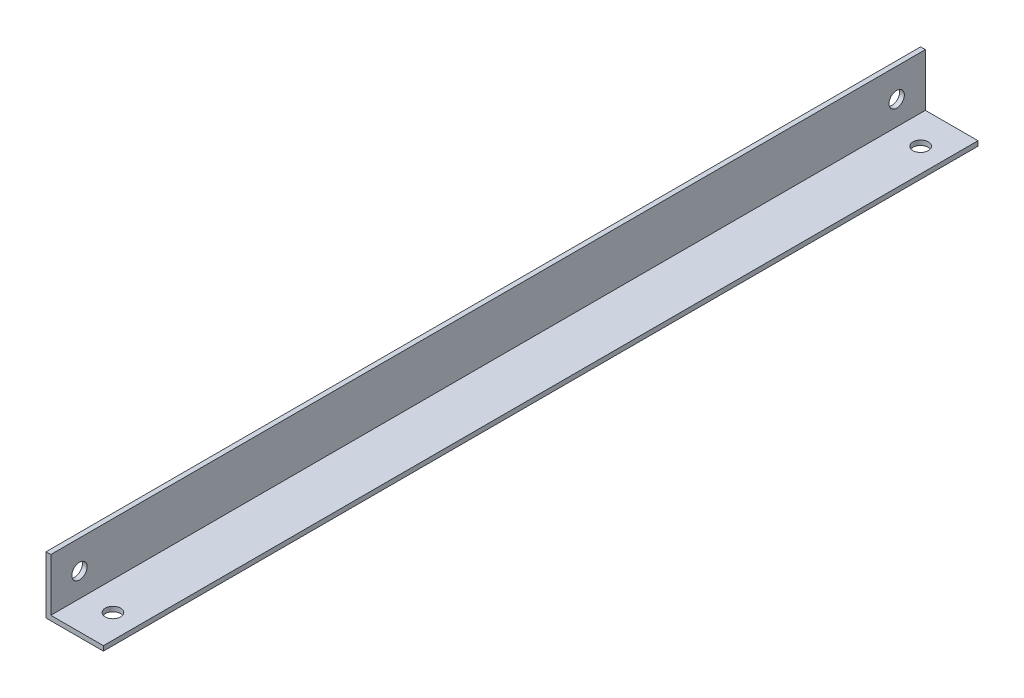
ISO-10303-21;
HEADER;
FILE_DESCRIPTION(('STEP AP214'),'2;1');
FILE_NAME('part.step','',(''),(''),'','','');
FILE_SCHEMA(('AUTOMOTIVE_DESIGN { 1 0 10303 214 1 1 1 1 }'));
ENDSEC;
DATA;
#1=APPLICATION_CONTEXT('core data for automotive mechanical design processes');
#2=APPLICATION_PROTOCOL_DEFINITION('international standard','automotive_design',2000,#1);
#3=PRODUCT_CONTEXT('',#1,'mechanical');
#4=PRODUCT('Part','Part','',(#3));
#5=PRODUCT_RELATED_PRODUCT_CATEGORY('part','',(#4));
#6=PRODUCT_DEFINITION_FORMATION('','',#4);
#7=PRODUCT_DEFINITION_CONTEXT('part definition',#1,'design');
#8=PRODUCT_DEFINITION('design','',#6,#7);
#9=PRODUCT_DEFINITION_SHAPE('','',#8);
#10=(LENGTH_UNIT() NAMED_UNIT(*) SI_UNIT(.MILLI.,.METRE.));
#11=(NAMED_UNIT(*) PLANE_ANGLE_UNIT() SI_UNIT($,.RADIAN.));
#12=(NAMED_UNIT(*) SI_UNIT($,.STERADIAN.) SOLID_ANGLE_UNIT());
#13=UNCERTAINTY_MEASURE_WITH_UNIT(LENGTH_MEASURE(1.E-05),#10,'distance_accuracy_value','');
#14=(GEOMETRIC_REPRESENTATION_CONTEXT(3) GLOBAL_UNCERTAINTY_ASSIGNED_CONTEXT((#13)) GLOBAL_UNIT_ASSIGNED_CONTEXT((#10,
#11,#12)) REPRESENTATION_CONTEXT('',''));
#15=CARTESIAN_POINT('',(0.,0.,0.));
#16=DIRECTION('',(0.,0.,1.));
#17=DIRECTION('',(1.,0.,0.));
#18=AXIS2_PLACEMENT_3D('',#15,#16,#17);
#19=CARTESIAN_POINT('',(30.,0.,457.2));
#20=DIRECTION('',(0.,1.,0.));
#21=DIRECTION('',(-1.,0.,0.));
#22=AXIS2_PLACEMENT_3D('',#19,#20,#21);
#23=PLANE('',#22);
#24=CARTESIAN_POINT('',(17.5,0.,439.7));
#25=DIRECTION('',(0.,1.,0.));
#26=DIRECTION('',(1.,0.,0.));
#27=AXIS2_PLACEMENT_3D('',#24,#25,#26);
#28=CIRCLE('',#27,4.);
#29=CARTESIAN_POINT('',(13.5,0.,439.7));
#30=VERTEX_POINT('',#29);
#31=EDGE_CURVE('E162',#30,#30,#28,.T.);
#32=ORIENTED_EDGE('',*,*,#31,.T.);
#33=EDGE_LOOP('',(#32));
#34=FACE_BOUND('',#33,.T.);
#35=CARTESIAN_POINT('',(17.5,0.,17.5));
#36=DIRECTION('',(0.,1.,0.));
#37=DIRECTION('',(-1.,0.,0.));
#38=AXIS2_PLACEMENT_3D('',#35,#36,#37);
#39=CIRCLE('',#38,4.);
#40=CARTESIAN_POINT('',(13.5,0.,17.5));
#41=VERTEX_POINT('',#40);
#42=EDGE_CURVE('E120',#41,#41,#39,.T.);
#43=ORIENTED_EDGE('',*,*,#42,.T.);
#44=EDGE_LOOP('',(#43));
#45=FACE_BOUND('',#44,.T.);
#46=DIRECTION('',(1.,0.,0.));
#47=VECTOR('',#46,1.);
#48=CARTESIAN_POINT('',(30.,0.,0.));
#49=LINE('',#48,#47);
#50=CARTESIAN_POINT('',(0.,0.,0.));
#51=VERTEX_POINT('',#50);
#52=CARTESIAN_POINT('',(30.,0.,0.));
#53=VERTEX_POINT('',#52);
#54=EDGE_CURVE('E116',#51,#53,#49,.T.);
#55=ORIENTED_EDGE('',*,*,#54,.T.);
#56=DIRECTION('',(0.,0.,-1.));
#57=VECTOR('',#56,1.);
#58=CARTESIAN_POINT('',(30.,0.,457.2));
#59=LINE('',#58,#57);
#60=CARTESIAN_POINT('',(30.,0.,457.2));
#61=VERTEX_POINT('',#60);
#62=EDGE_CURVE('E11',#61,#53,#59,.T.);
#63=ORIENTED_EDGE('',*,*,#62,.F.);
#64=DIRECTION('',(1.,0.,0.));
#65=VECTOR('',#64,1.);
#66=CARTESIAN_POINT('',(30.,0.,457.2));
#67=LINE('',#66,#65);
#68=CARTESIAN_POINT('',(0.,0.,457.2));
#69=VERTEX_POINT('',#68);
#70=EDGE_CURVE('E127',#69,#61,#67,.T.);
#71=ORIENTED_EDGE('',*,*,#70,.F.);
#72=DIRECTION('',(0.,0.,-1.));
#73=VECTOR('',#72,1.);
#74=CARTESIAN_POINT('',(0.,0.,457.2));
#75=LINE('',#74,#73);
#76=EDGE_CURVE('E112',#69,#51,#75,.T.);
#77=ORIENTED_EDGE('',*,*,#76,.T.);
#78=EDGE_LOOP('',(#55,#63,#71,#77));
#79=FACE_BOUND('',#78,.T.);
#80=ADVANCED_FACE('F32',(#34,#45,#79),#23,.F.);
#81=CARTESIAN_POINT('',(30.,2.5,457.2));
#82=DIRECTION('',(-1.,0.,0.));
#83=DIRECTION('',(0.,0.,1.));
#84=AXIS2_PLACEMENT_3D('',#81,#82,#83);
#85=PLANE('',#84);
#86=DIRECTION('',(0.,1.,0.));
#87=VECTOR('',#86,1.);
#88=CARTESIAN_POINT('',(30.,2.5,0.));
#89=LINE('',#88,#87);
#90=CARTESIAN_POINT('',(30.,2.5,0.));
#91=VERTEX_POINT('',#90);
#92=EDGE_CURVE('E119',#53,#91,#89,.T.);
#93=ORIENTED_EDGE('',*,*,#92,.T.);
#94=DIRECTION('',(0.,0.,-1.));
#95=VECTOR('',#94,1.);
#96=CARTESIAN_POINT('',(30.,2.5,457.2));
#97=LINE('',#96,#95);
#98=CARTESIAN_POINT('',(30.,2.5,457.2));
#99=VERTEX_POINT('',#98);
#100=EDGE_CURVE('E40',#99,#91,#97,.T.);
#101=ORIENTED_EDGE('',*,*,#100,.F.);
#102=DIRECTION('',(0.,1.,0.));
#103=VECTOR('',#102,1.);
#104=CARTESIAN_POINT('',(30.,2.5,457.2));
#105=LINE('',#104,#103);
#106=EDGE_CURVE('E85',#61,#99,#105,.T.);
#107=ORIENTED_EDGE('',*,*,#106,.F.);
#108=ORIENTED_EDGE('',*,*,#62,.T.);
#109=EDGE_LOOP('',(#93,#101,#107,#108));
#110=FACE_BOUND('',#109,.T.);
#111=ADVANCED_FACE('F154',(#110),#85,.F.);
#112=CARTESIAN_POINT('',(2.5,2.5,457.2));
#113=DIRECTION('',(0.,-1.,0.));
#114=DIRECTION('',(1.,0.,0.));
#115=AXIS2_PLACEMENT_3D('',#112,#113,#114);
#116=PLANE('',#115);
#117=CARTESIAN_POINT('',(17.5,2.5,439.7));
#118=DIRECTION('',(0.,1.,0.));
#119=DIRECTION('',(1.,0.,0.));
#120=AXIS2_PLACEMENT_3D('',#117,#118,#119);
#121=CIRCLE('',#120,4.);
#122=CARTESIAN_POINT('',(13.5,2.5,439.7));
#123=VERTEX_POINT('',#122);
#124=EDGE_CURVE('E171',#123,#123,#121,.T.);
#125=ORIENTED_EDGE('',*,*,#124,.F.);
#126=EDGE_LOOP('',(#125));
#127=FACE_BOUND('',#126,.T.);
#128=CARTESIAN_POINT('',(17.5,2.5,17.5));
#129=DIRECTION('',(0.,1.,0.));
#130=DIRECTION('',(-1.,0.,0.));
#131=AXIS2_PLACEMENT_3D('',#128,#129,#130);
#132=CIRCLE('',#131,4.);
#133=CARTESIAN_POINT('',(13.5,2.5,17.5));
#134=VERTEX_POINT('',#133);
#135=EDGE_CURVE('E166',#134,#134,#132,.T.);
#136=ORIENTED_EDGE('',*,*,#135,.F.);
#137=EDGE_LOOP('',(#136));
#138=FACE_BOUND('',#137,.T.);
#139=DIRECTION('',(-1.,0.,0.));
#140=VECTOR('',#139,1.);
#141=CARTESIAN_POINT('',(2.5,2.5,0.));
#142=LINE('',#141,#140);
#143=CARTESIAN_POINT('',(2.5,2.5,0.));
#144=VERTEX_POINT('',#143);
#145=EDGE_CURVE('E122',#91,#144,#142,.T.);
#146=ORIENTED_EDGE('',*,*,#145,.T.);
#147=DIRECTION('',(0.,0.,-1.));
#148=VECTOR('',#147,1.);
#149=CARTESIAN_POINT('',(2.5,2.5,457.2));
#150=LINE('',#149,#148);
#151=CARTESIAN_POINT('',(2.5,2.5,457.2));
#152=VERTEX_POINT('',#151);
#153=EDGE_CURVE('E107',#152,#144,#150,.T.);
#154=ORIENTED_EDGE('',*,*,#153,.F.);
#155=DIRECTION('',(-1.,0.,0.));
#156=VECTOR('',#155,1.);
#157=CARTESIAN_POINT('',(2.5,2.5,457.2));
#158=LINE('',#157,#156);
#159=EDGE_CURVE('E98',#99,#152,#158,.T.);
#160=ORIENTED_EDGE('',*,*,#159,.F.);
#161=ORIENTED_EDGE('',*,*,#100,.T.);
#162=EDGE_LOOP('',(#146,#154,#160,#161));
#163=FACE_BOUND('',#162,.T.);
#164=ADVANCED_FACE('F133',(#127,#138,#163),#116,.F.);
#165=CARTESIAN_POINT('',(2.5,30.,457.2));
#166=DIRECTION('',(-1.,0.,0.));
#167=DIRECTION('',(0.,-1.,0.));
#168=AXIS2_PLACEMENT_3D('',#165,#166,#167);
#169=PLANE('',#168);
#170=CARTESIAN_POINT('',(2.5,14.9999999999999,442.2));
#171=DIRECTION('',(1.,0.,0.));
#172=DIRECTION('',(0.,-1.,0.));
#173=AXIS2_PLACEMENT_3D('',#170,#171,#172);
#174=CIRCLE('',#173,3.99999999999999);
#175=CARTESIAN_POINT('',(2.5,11.,442.2));
#176=VERTEX_POINT('',#175);
#177=EDGE_CURVE('E184',#176,#176,#174,.T.);
#178=ORIENTED_EDGE('',*,*,#177,.F.);
#179=EDGE_LOOP('',(#178));
#180=FACE_BOUND('',#179,.T.);
#181=CARTESIAN_POINT('',(2.5,15.,15.));
#182=DIRECTION('',(1.,0.,0.));
#183=DIRECTION('',(0.,1.,0.));
#184=AXIS2_PLACEMENT_3D('',#181,#182,#183);
#185=CIRCLE('',#184,4.);
#186=CARTESIAN_POINT('',(2.5,19.,15.));
#187=VERTEX_POINT('',#186);
#188=EDGE_CURVE('E178',#187,#187,#185,.T.);
#189=ORIENTED_EDGE('',*,*,#188,.F.);
#190=EDGE_LOOP('',(#189));
#191=FACE_BOUND('',#190,.T.);
#192=DIRECTION('',(0.,1.,0.));
#193=VECTOR('',#192,1.);
#194=CARTESIAN_POINT('',(2.5,30.,0.));
#195=LINE('',#194,#193);
#196=CARTESIAN_POINT('',(2.5,30.,0.));
#197=VERTEX_POINT('',#196);
#198=EDGE_CURVE('E106',#144,#197,#195,.T.);
#199=ORIENTED_EDGE('',*,*,#198,.T.);
#200=DIRECTION('',(0.,0.,-1.));
#201=VECTOR('',#200,1.);
#202=CARTESIAN_POINT('',(2.5,30.,457.2));
#203=LINE('',#202,#201);
#204=CARTESIAN_POINT('',(2.5,30.,457.2));
#205=VERTEX_POINT('',#204);
#206=EDGE_CURVE('E103',#205,#197,#203,.T.);
#207=ORIENTED_EDGE('',*,*,#206,.F.);
#208=DIRECTION('',(0.,1.,0.));
#209=VECTOR('',#208,1.);
#210=CARTESIAN_POINT('',(2.5,30.,457.2));
#211=LINE('',#210,#209);
#212=EDGE_CURVE('E92',#152,#205,#211,.T.);
#213=ORIENTED_EDGE('',*,*,#212,.F.);
#214=ORIENTED_EDGE('',*,*,#153,.T.);
#215=EDGE_LOOP('',(#199,#207,#213,#214));
#216=FACE_BOUND('',#215,.T.);
#217=ADVANCED_FACE('F104',(#180,#191,#216),#169,.F.);
#218=CARTESIAN_POINT('',(0.,30.,457.2));
#219=DIRECTION('',(0.,-1.,0.));
#220=DIRECTION('',(0.,0.,-1.));
#221=AXIS2_PLACEMENT_3D('',#218,#219,#220);
#222=PLANE('',#221);
#223=DIRECTION('',(-1.,0.,0.));
#224=VECTOR('',#223,1.);
#225=CARTESIAN_POINT('',(0.,30.,0.));
#226=LINE('',#225,#224);
#227=CARTESIAN_POINT('',(0.,30.,0.));
#228=VERTEX_POINT('',#227);
#229=EDGE_CURVE('E71',#197,#228,#226,.T.);
#230=ORIENTED_EDGE('',*,*,#229,.T.);
#231=DIRECTION('',(0.,0.,-1.));
#232=VECTOR('',#231,1.);
#233=CARTESIAN_POINT('',(0.,30.,457.2));
#234=LINE('',#233,#232);
#235=CARTESIAN_POINT('',(0.,30.,457.2));
#236=VERTEX_POINT('',#235);
#237=EDGE_CURVE('E108',#236,#228,#234,.T.);
#238=ORIENTED_EDGE('',*,*,#237,.F.);
#239=DIRECTION('',(-1.,0.,0.));
#240=VECTOR('',#239,1.);
#241=CARTESIAN_POINT('',(0.,30.,457.2));
#242=LINE('',#241,#240);
#243=EDGE_CURVE('E96',#205,#236,#242,.T.);
#244=ORIENTED_EDGE('',*,*,#243,.F.);
#245=ORIENTED_EDGE('',*,*,#206,.T.);
#246=EDGE_LOOP('',(#230,#238,#244,#245));
#247=FACE_BOUND('',#246,.T.);
#248=ADVANCED_FACE('F110',(#247),#222,.F.);
#249=CARTESIAN_POINT('',(0.,0.,457.2));
#250=DIRECTION('',(1.,0.,0.));
#251=DIRECTION('',(0.,0.,-1.));
#252=AXIS2_PLACEMENT_3D('',#249,#250,#251);
#253=PLANE('',#252);
#254=CARTESIAN_POINT('',(0.,14.9999999999999,442.2));
#255=DIRECTION('',(1.,0.,0.));
#256=DIRECTION('',(0.,-1.,0.));
#257=AXIS2_PLACEMENT_3D('',#254,#255,#256);
#258=CIRCLE('',#257,3.99999999999999);
#259=CARTESIAN_POINT('',(0.,11.,442.2));
#260=VERTEX_POINT('',#259);
#261=EDGE_CURVE('E181',#260,#260,#258,.T.);
#262=ORIENTED_EDGE('',*,*,#261,.T.);
#263=EDGE_LOOP('',(#262));
#264=FACE_BOUND('',#263,.T.);
#265=CARTESIAN_POINT('',(0.,15.,15.));
#266=DIRECTION('',(1.,0.,0.));
#267=DIRECTION('',(0.,1.,0.));
#268=AXIS2_PLACEMENT_3D('',#265,#266,#267);
#269=CIRCLE('',#268,4.);
#270=CARTESIAN_POINT('',(0.,19.,15.));
#271=VERTEX_POINT('',#270);
#272=EDGE_CURVE('E176',#271,#271,#269,.T.);
#273=ORIENTED_EDGE('',*,*,#272,.T.);
#274=EDGE_LOOP('',(#273));
#275=FACE_BOUND('',#274,.T.);
#276=DIRECTION('',(0.,-1.,0.));
#277=VECTOR('',#276,1.);
#278=CARTESIAN_POINT('',(0.,0.,0.));
#279=LINE('',#278,#277);
#280=EDGE_CURVE('E77',#228,#51,#279,.T.);
#281=ORIENTED_EDGE('',*,*,#280,.T.);
#282=ORIENTED_EDGE('',*,*,#76,.F.);
#283=DIRECTION('',(0.,-1.,0.));
#284=VECTOR('',#283,1.);
#285=CARTESIAN_POINT('',(0.,0.,457.2));
#286=LINE('',#285,#284);
#287=EDGE_CURVE('E48',#236,#69,#286,.T.);
#288=ORIENTED_EDGE('',*,*,#287,.F.);
#289=ORIENTED_EDGE('',*,*,#237,.T.);
#290=EDGE_LOOP('',(#281,#282,#288,#289));
#291=FACE_BOUND('',#290,.T.);
#292=ADVANCED_FACE('F140',(#264,#275,#291),#253,.F.);
#293=CARTESIAN_POINT('',(0.,0.,457.2));
#294=DIRECTION('',(0.,0.,-1.));
#295=DIRECTION('',(-1.,0.,0.));
#296=AXIS2_PLACEMENT_3D('',#293,#294,#295);
#297=PLANE('',#296);
#298=ORIENTED_EDGE('',*,*,#70,.T.);
#299=ORIENTED_EDGE('',*,*,#106,.T.);
#300=ORIENTED_EDGE('',*,*,#159,.T.);
#301=ORIENTED_EDGE('',*,*,#212,.T.);
#302=ORIENTED_EDGE('',*,*,#243,.T.);
#303=ORIENTED_EDGE('',*,*,#287,.T.);
#304=EDGE_LOOP('',(#298,#299,#300,#301,#302,#303));
#305=FACE_BOUND('',#304,.T.);
#306=ADVANCED_FACE('F94',(#305),#297,.F.);
#307=CARTESIAN_POINT('',(0.,0.,0.));
#308=DIRECTION('',(0.,0.,-1.));
#309=DIRECTION('',(-1.,0.,0.));
#310=AXIS2_PLACEMENT_3D('',#307,#308,#309);
#311=PLANE('',#310);
#312=ORIENTED_EDGE('',*,*,#54,.F.);
#313=ORIENTED_EDGE('',*,*,#280,.F.);
#314=ORIENTED_EDGE('',*,*,#229,.F.);
#315=ORIENTED_EDGE('',*,*,#198,.F.);
#316=ORIENTED_EDGE('',*,*,#145,.F.);
#317=ORIENTED_EDGE('',*,*,#92,.F.);
#318=EDGE_LOOP('',(#312,#313,#314,#315,#316,#317));
#319=FACE_BOUND('',#318,.T.);
#320=ADVANCED_FACE('F136',(#319),#311,.T.);
#321=CARTESIAN_POINT('',(17.5,0.,17.5));
#322=DIRECTION('',(0.,1.,0.));
#323=DIRECTION('',(-1.,0.,0.));
#324=AXIS2_PLACEMENT_3D('',#321,#322,#323);
#325=CYLINDRICAL_SURFACE('',#324,4.);
#326=CARTESIAN_POINT('',(13.5,0.,17.5));
#327=CARTESIAN_POINT('',(13.5,0.0260416666666656,17.5));
#328=CARTESIAN_POINT('',(13.5,0.0520833333333322,17.5));
#329=CARTESIAN_POINT('',(13.5,0.104166666666666,17.5));
#330=CARTESIAN_POINT('',(13.5,0.130208333333332,17.5));
#331=CARTESIAN_POINT('',(13.5,0.182291666666666,17.5));
#332=CARTESIAN_POINT('',(13.5,0.208333333333332,17.5));
#333=CARTESIAN_POINT('',(13.5,0.260416666666666,17.5));
#334=CARTESIAN_POINT('',(13.5,0.286458333333332,17.5));
#335=CARTESIAN_POINT('',(13.5,0.338541666666666,17.5));
#336=CARTESIAN_POINT('',(13.5,0.364583333333332,17.5));
#337=CARTESIAN_POINT('',(13.5,0.416666666666666,17.5));
#338=CARTESIAN_POINT('',(13.5,0.442708333333332,17.5));
#339=CARTESIAN_POINT('',(13.5,0.494791666666666,17.5));
#340=CARTESIAN_POINT('',(13.5,0.520833333333332,17.5));
#341=CARTESIAN_POINT('',(13.5,0.572916666666666,17.5));
#342=CARTESIAN_POINT('',(13.5,0.598958333333332,17.5));
#343=CARTESIAN_POINT('',(13.5,0.651041666666666,17.5));
#344=CARTESIAN_POINT('',(13.5,0.677083333333332,17.5));
#345=CARTESIAN_POINT('',(13.5,0.729166666666666,17.5));
#346=CARTESIAN_POINT('',(13.5,0.755208333333333,17.5));
#347=CARTESIAN_POINT('',(13.5,0.807291666666666,17.5));
#348=CARTESIAN_POINT('',(13.5,0.833333333333333,17.5));
#349=CARTESIAN_POINT('',(13.5,0.885416666666666,17.5));
#350=CARTESIAN_POINT('',(13.5,0.911458333333333,17.5));
#351=CARTESIAN_POINT('',(13.5,0.963541666666666,17.5));
#352=CARTESIAN_POINT('',(13.5,0.989583333333333,17.5));
#353=CARTESIAN_POINT('',(13.5,1.04166666666667,17.5));
#354=CARTESIAN_POINT('',(13.5,1.06770833333333,17.5));
#355=CARTESIAN_POINT('',(13.5,1.11979166666667,17.5));
#356=CARTESIAN_POINT('',(13.5,1.14583333333333,17.5));
#357=CARTESIAN_POINT('',(13.5,1.19791666666667,17.5));
#358=CARTESIAN_POINT('',(13.5,1.22395833333333,17.5));
#359=CARTESIAN_POINT('',(13.5,1.27604166666667,17.5));
#360=CARTESIAN_POINT('',(13.5,1.30208333333333,17.5));
#361=CARTESIAN_POINT('',(13.5,1.35416666666667,17.5));
#362=CARTESIAN_POINT('',(13.5,1.38020833333333,17.5));
#363=CARTESIAN_POINT('',(13.5,1.43229166666667,17.5));
#364=CARTESIAN_POINT('',(13.5,1.45833333333333,17.5));
#365=CARTESIAN_POINT('',(13.5,1.51041666666667,17.5));
#366=CARTESIAN_POINT('',(13.5,1.53645833333333,17.5));
#367=CARTESIAN_POINT('',(13.5,1.58854166666667,17.5));
#368=CARTESIAN_POINT('',(13.5,1.61458333333333,17.5));
#369=CARTESIAN_POINT('',(13.5,1.66666666666667,17.5));
#370=CARTESIAN_POINT('',(13.5,1.69270833333333,17.5));
#371=CARTESIAN_POINT('',(13.5,1.74479166666667,17.5));
#372=CARTESIAN_POINT('',(13.5,1.77083333333333,17.5));
#373=CARTESIAN_POINT('',(13.5,1.82291666666667,17.5));
#374=CARTESIAN_POINT('',(13.5,1.84895833333333,17.5));
#375=CARTESIAN_POINT('',(13.5,1.90104166666667,17.5));
#376=CARTESIAN_POINT('',(13.5,1.92708333333333,17.5));
#377=CARTESIAN_POINT('',(13.5,1.97916666666667,17.5));
#378=CARTESIAN_POINT('',(13.5,2.00520833333333,17.5));
#379=CARTESIAN_POINT('',(13.5,2.05729166666667,17.5));
#380=CARTESIAN_POINT('',(13.5,2.08333333333333,17.5));
#381=CARTESIAN_POINT('',(13.5,2.13541666666667,17.5));
#382=CARTESIAN_POINT('',(13.5,2.16145833333333,17.5));
#383=CARTESIAN_POINT('',(13.5,2.21354166666667,17.5));
#384=CARTESIAN_POINT('',(13.5,2.23958333333333,17.5));
#385=CARTESIAN_POINT('',(13.5,2.29166666666667,17.5));
#386=CARTESIAN_POINT('',(13.5,2.31770833333333,17.5));
#387=CARTESIAN_POINT('',(13.5,2.36979166666667,17.5));
#388=CARTESIAN_POINT('',(13.5,2.39583333333333,17.5));
#389=CARTESIAN_POINT('',(13.5,2.44791666666667,17.5));
#390=CARTESIAN_POINT('',(13.5,2.47395833333333,17.5));
#391=CARTESIAN_POINT('',(13.5,2.5,17.5));
#392=B_SPLINE_CURVE_WITH_KNOTS('',3,(#326,#327,#328,#329,#330,#331,#332,#333,#334,#335,#336,
#337,#338,#339,#340,#341,#342,#343,#344,#345,#346,#347,#348,#349,#350,#351,#352,#353,#354,#355,
#356,#357,#358,#359,#360,#361,#362,#363,#364,#365,#366,#367,#368,#369,#370,#371,#372,#373,#374,
#375,#376,#377,#378,#379,#380,#381,#382,#383,#384,#385,#386,#387,#388,#389,#390,#391),
.UNSPECIFIED.,.F.,.F.,(4,2,2,2,2,2,2,2,2,2,2,2,2,2,2,2,2,2,2,2,2,2,2,2,2,2,2,2,2,2,2,2,4),(0.,
0.078125,0.15625,0.234375,0.3125,0.390625,0.46875,0.546875,0.625,0.703125,0.78125,0.859375,
0.9375,1.015625,1.09375,1.171875,1.25,1.328125,1.40625,1.484375,1.5625,1.640625,1.71875,
1.796875,1.875,1.953125,2.03125,2.109375,2.1875,2.265625,2.34375,2.421875,2.5),.UNSPECIFIED.);
#393=EDGE_CURVE('BSEAM208',#41,#134,#392,.T.);
#394=ORIENTED_EDGE('',*,*,#42,.F.);
#395=ORIENTED_EDGE('',*,*,#135,.T.);
#396=ORIENTED_EDGE('',*,*,#393,.T.);
#397=ORIENTED_EDGE('',*,*,#393,.F.);
#398=EDGE_LOOP('',(#394,#396,#395,#397));
#399=FACE_BOUND('',#398,.T.);
#400=ADVANCED_FACE('F208',(#399),#325,.F.);
#401=CARTESIAN_POINT('',(17.5,0.,439.7));
#402=DIRECTION('',(0.,1.,0.));
#403=DIRECTION('',(-1.,0.,0.));
#404=AXIS2_PLACEMENT_3D('',#401,#402,#403);
#405=CYLINDRICAL_SURFACE('',#404,4.);
#406=CARTESIAN_POINT('',(13.5,0.,439.7));
#407=CARTESIAN_POINT('',(13.5,0.0260416666666656,439.7));
#408=CARTESIAN_POINT('',(13.5,0.0520833333333322,439.7));
#409=CARTESIAN_POINT('',(13.5,0.104166666666666,439.7));
#410=CARTESIAN_POINT('',(13.5,0.130208333333332,439.7));
#411=CARTESIAN_POINT('',(13.5,0.182291666666666,439.7));
#412=CARTESIAN_POINT('',(13.5,0.208333333333332,439.7));
#413=CARTESIAN_POINT('',(13.5,0.260416666666666,439.7));
#414=CARTESIAN_POINT('',(13.5,0.286458333333332,439.7));
#415=CARTESIAN_POINT('',(13.5,0.338541666666666,439.7));
#416=CARTESIAN_POINT('',(13.5,0.364583333333332,439.7));
#417=CARTESIAN_POINT('',(13.5,0.416666666666666,439.7));
#418=CARTESIAN_POINT('',(13.5,0.442708333333332,439.7));
#419=CARTESIAN_POINT('',(13.5,0.494791666666666,439.7));
#420=CARTESIAN_POINT('',(13.5,0.520833333333332,439.7));
#421=CARTESIAN_POINT('',(13.5,0.572916666666666,439.7));
#422=CARTESIAN_POINT('',(13.5,0.598958333333332,439.7));
#423=CARTESIAN_POINT('',(13.5,0.651041666666666,439.7));
#424=CARTESIAN_POINT('',(13.5,0.677083333333332,439.7));
#425=CARTESIAN_POINT('',(13.5,0.729166666666666,439.7));
#426=CARTESIAN_POINT('',(13.5,0.755208333333333,439.7));
#427=CARTESIAN_POINT('',(13.5,0.807291666666666,439.7));
#428=CARTESIAN_POINT('',(13.5,0.833333333333333,439.7));
#429=CARTESIAN_POINT('',(13.5,0.885416666666666,439.7));
#430=CARTESIAN_POINT('',(13.5,0.911458333333333,439.7));
#431=CARTESIAN_POINT('',(13.5,0.963541666666666,439.7));
#432=CARTESIAN_POINT('',(13.5,0.989583333333333,439.7));
#433=CARTESIAN_POINT('',(13.5,1.04166666666667,439.7));
#434=CARTESIAN_POINT('',(13.5,1.06770833333333,439.7));
#435=CARTESIAN_POINT('',(13.5,1.11979166666667,439.7));
#436=CARTESIAN_POINT('',(13.5,1.14583333333333,439.7));
#437=CARTESIAN_POINT('',(13.5,1.19791666666667,439.7));
#438=CARTESIAN_POINT('',(13.5,1.22395833333333,439.7));
#439=CARTESIAN_POINT('',(13.5,1.27604166666667,439.7));
#440=CARTESIAN_POINT('',(13.5,1.30208333333333,439.7));
#441=CARTESIAN_POINT('',(13.5,1.35416666666667,439.7));
#442=CARTESIAN_POINT('',(13.5,1.38020833333333,439.7));
#443=CARTESIAN_POINT('',(13.5,1.43229166666667,439.7));
#444=CARTESIAN_POINT('',(13.5,1.45833333333333,439.7));
#445=CARTESIAN_POINT('',(13.5,1.51041666666667,439.7));
#446=CARTESIAN_POINT('',(13.5,1.53645833333333,439.7));
#447=CARTESIAN_POINT('',(13.5,1.58854166666667,439.7));
#448=CARTESIAN_POINT('',(13.5,1.61458333333333,439.7));
#449=CARTESIAN_POINT('',(13.5,1.66666666666667,439.7));
#450=CARTESIAN_POINT('',(13.5,1.69270833333333,439.7));
#451=CARTESIAN_POINT('',(13.5,1.74479166666667,439.7));
#452=CARTESIAN_POINT('',(13.5,1.77083333333333,439.7));
#453=CARTESIAN_POINT('',(13.5,1.82291666666667,439.7));
#454=CARTESIAN_POINT('',(13.5,1.84895833333333,439.7));
#455=CARTESIAN_POINT('',(13.5,1.90104166666667,439.7));
#456=CARTESIAN_POINT('',(13.5,1.92708333333333,439.7));
#457=CARTESIAN_POINT('',(13.5,1.97916666666667,439.7));
#458=CARTESIAN_POINT('',(13.5,2.00520833333333,439.7));
#459=CARTESIAN_POINT('',(13.5,2.05729166666667,439.7));
#460=CARTESIAN_POINT('',(13.5,2.08333333333333,439.7));
#461=CARTESIAN_POINT('',(13.5,2.13541666666667,439.7));
#462=CARTESIAN_POINT('',(13.5,2.16145833333333,439.7));
#463=CARTESIAN_POINT('',(13.5,2.21354166666667,439.7));
#464=CARTESIAN_POINT('',(13.5,2.23958333333333,439.7));
#465=CARTESIAN_POINT('',(13.5,2.29166666666667,439.7));
#466=CARTESIAN_POINT('',(13.5,2.31770833333333,439.7));
#467=CARTESIAN_POINT('',(13.5,2.36979166666667,439.7));
#468=CARTESIAN_POINT('',(13.5,2.39583333333333,439.7));
#469=CARTESIAN_POINT('',(13.5,2.44791666666667,439.7));
#470=CARTESIAN_POINT('',(13.5,2.47395833333333,439.7));
#471=CARTESIAN_POINT('',(13.5,2.5,439.7));
#472=B_SPLINE_CURVE_WITH_KNOTS('',3,(#406,#407,#408,#409,#410,#411,#412,#413,#414,#415,#416,
#417,#418,#419,#420,#421,#422,#423,#424,#425,#426,#427,#428,#429,#430,#431,#432,#433,#434,#435,
#436,#437,#438,#439,#440,#441,#442,#443,#444,#445,#446,#447,#448,#449,#450,#451,#452,#453,#454,
#455,#456,#457,#458,#459,#460,#461,#462,#463,#464,#465,#466,#467,#468,#469,#470,#471),
.UNSPECIFIED.,.F.,.F.,(4,2,2,2,2,2,2,2,2,2,2,2,2,2,2,2,2,2,2,2,2,2,2,2,2,2,2,2,2,2,2,2,4),(0.,
0.078125,0.15625,0.234375,0.3125,0.390625,0.46875,0.546875,0.625,0.703125,0.78125,0.859375,
0.9375,1.015625,1.09375,1.171875,1.25,1.328125,1.40625,1.484375,1.5625,1.640625,1.71875,
1.796875,1.875,1.953125,2.03125,2.109375,2.1875,2.265625,2.34375,2.421875,2.5),.UNSPECIFIED.);
#473=EDGE_CURVE('BSEAM202',#30,#123,#472,.T.);
#474=ORIENTED_EDGE('',*,*,#31,.F.);
#475=ORIENTED_EDGE('',*,*,#124,.T.);
#476=ORIENTED_EDGE('',*,*,#473,.T.);
#477=ORIENTED_EDGE('',*,*,#473,.F.);
#478=EDGE_LOOP('',(#474,#476,#475,#477));
#479=FACE_BOUND('',#478,.T.);
#480=ADVANCED_FACE('F202',(#479),#405,.F.);
#481=CARTESIAN_POINT('',(0.,15.,15.));
#482=DIRECTION('',(1.,0.,0.));
#483=DIRECTION('',(0.,1.,0.));
#484=AXIS2_PLACEMENT_3D('',#481,#482,#483);
#485=CYLINDRICAL_SURFACE('',#484,4.);
#486=ORIENTED_EDGE('',*,*,#272,.F.);
#487=EDGE_LOOP('',(#486));
#488=FACE_BOUND('',#487,.T.);
#489=ORIENTED_EDGE('',*,*,#188,.T.);
#490=EDGE_LOOP('',(#489));
#491=FACE_BOUND('',#490,.T.);
#492=ADVANCED_FACE('F192',(#488,#491),#485,.F.);
#493=CARTESIAN_POINT('',(0.,14.9999999999999,442.2));
#494=DIRECTION('',(1.,0.,0.));
#495=DIRECTION('',(0.,1.,0.));
#496=AXIS2_PLACEMENT_3D('',#493,#494,#495);
#497=CYLINDRICAL_SURFACE('',#496,3.99999999999999);
#498=ORIENTED_EDGE('',*,*,#261,.F.);
#499=EDGE_LOOP('',(#498));
#500=FACE_BOUND('',#499,.T.);
#501=ORIENTED_EDGE('',*,*,#177,.T.);
#502=EDGE_LOOP('',(#501));
#503=FACE_BOUND('',#502,.T.);
#504=ADVANCED_FACE('F189',(#500,#503),#497,.F.);
#505=CLOSED_SHELL('',(#80,#111,#164,#217,#248,#292,#306,#320,#400,#480,#492,#504));
#506=MANIFOLD_SOLID_BREP('B2',#505);
#507=ADVANCED_BREP_SHAPE_REPRESENTATION('',(#18,#506),#14);
#508=SHAPE_DEFINITION_REPRESENTATION(#9,#507);
ENDSEC;
END-ISO-10303-21;
